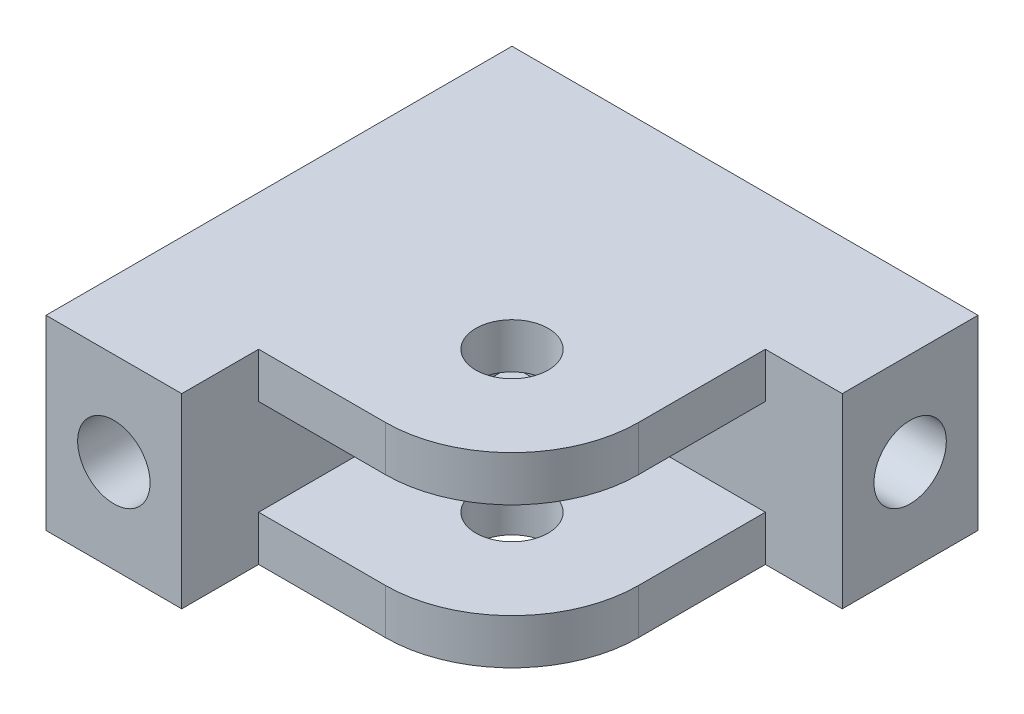
ISO-10303-21;
HEADER;
FILE_DESCRIPTION(('STEP AP214'),'2;1');
FILE_NAME('part.step','',(''),(''),'','','');
FILE_SCHEMA(('AUTOMOTIVE_DESIGN { 1 0 10303 214 1 1 1 1 }'));
ENDSEC;
DATA;
#1=APPLICATION_CONTEXT('core data for automotive mechanical design processes');
#2=APPLICATION_PROTOCOL_DEFINITION('international standard','automotive_design',2000,#1);
#3=PRODUCT_CONTEXT('',#1,'mechanical');
#4=PRODUCT('Part','Part','',(#3));
#5=PRODUCT_RELATED_PRODUCT_CATEGORY('part','',(#4));
#6=PRODUCT_DEFINITION_FORMATION('','',#4);
#7=PRODUCT_DEFINITION_CONTEXT('part definition',#1,'design');
#8=PRODUCT_DEFINITION('design','',#6,#7);
#9=PRODUCT_DEFINITION_SHAPE('','',#8);
#10=(LENGTH_UNIT() NAMED_UNIT(*) SI_UNIT(.MILLI.,.METRE.));
#11=(NAMED_UNIT(*) PLANE_ANGLE_UNIT() SI_UNIT($,.RADIAN.));
#12=(NAMED_UNIT(*) SI_UNIT($,.STERADIAN.) SOLID_ANGLE_UNIT());
#13=UNCERTAINTY_MEASURE_WITH_UNIT(LENGTH_MEASURE(1.E-05),#10,'distance_accuracy_value','');
#14=(GEOMETRIC_REPRESENTATION_CONTEXT(3) GLOBAL_UNCERTAINTY_ASSIGNED_CONTEXT((#13)) GLOBAL_UNIT_ASSIGNED_CONTEXT((#10,
#11,#12)) REPRESENTATION_CONTEXT('',''));
#15=CARTESIAN_POINT('',(0.,0.,0.));
#16=DIRECTION('',(0.,0.,1.));
#17=DIRECTION('',(1.,0.,0.));
#18=AXIS2_PLACEMENT_3D('',#15,#16,#17);
#19=CARTESIAN_POINT('',(-38.4937857618097,20.6,0.));
#20=DIRECTION('',(-1.,0.,0.));
#21=DIRECTION('',(0.,0.,1.));
#22=AXIS2_PLACEMENT_3D('',#19,#20,#21);
#23=PLANE('',#22);
#24=DIRECTION('',(0.,1.,0.));
#25=VECTOR('',#24,1.);
#26=CARTESIAN_POINT('',(-38.4937857618097,15.6,-15.6373422700728));
#27=LINE('',#26,#25);
#28=CARTESIAN_POINT('',(-38.4937857618097,15.6,-15.6373422700728));
#29=VERTEX_POINT('',#28);
#30=CARTESIAN_POINT('',(-38.4937857618097,20.6,-15.6373422700728));
#31=VERTEX_POINT('',#30);
#32=EDGE_CURVE('E153',#29,#31,#27,.T.);
#33=ORIENTED_EDGE('',*,*,#32,.T.);
#34=DIRECTION('',(0.,0.,-1.));
#35=VECTOR('',#34,1.);
#36=CARTESIAN_POINT('',(-38.4937857618097,20.6,0.));
#37=LINE('',#36,#35);
#38=CARTESIAN_POINT('',(-38.4937857618097,20.6,-7.13734227007282));
#39=VERTEX_POINT('',#38);
#40=EDGE_CURVE('E225',#39,#31,#37,.T.);
#41=ORIENTED_EDGE('',*,*,#40,.F.);
#42=DIRECTION('',(0.,-1.,0.));
#43=VECTOR('',#42,1.);
#44=CARTESIAN_POINT('',(-38.4937857618097,20.6,-7.13734227007282));
#45=LINE('',#44,#43);
#46=CARTESIAN_POINT('',(-38.4937857618097,0.,-7.13734227007282));
#47=VERTEX_POINT('',#46);
#48=EDGE_CURVE('E264',#39,#47,#45,.T.);
#49=ORIENTED_EDGE('',*,*,#48,.T.);
#50=DIRECTION('',(0.,0.,-1.));
#51=VECTOR('',#50,1.);
#52=CARTESIAN_POINT('',(-38.4937857618097,0.,0.));
#53=LINE('',#52,#51);
#54=CARTESIAN_POINT('',(-38.4937857618097,0.,-15.6373422700728));
#55=VERTEX_POINT('',#54);
#56=EDGE_CURVE('E242',#47,#55,#53,.T.);
#57=ORIENTED_EDGE('',*,*,#56,.T.);
#58=DIRECTION('',(0.,-1.,0.));
#59=VECTOR('',#58,1.);
#60=CARTESIAN_POINT('',(-38.4937857618097,5.,-15.6373422700728));
#61=LINE('',#60,#59);
#62=CARTESIAN_POINT('',(-38.4937857618097,5.,-15.6373422700728));
#63=VERTEX_POINT('',#62);
#64=EDGE_CURVE('E201',#63,#55,#61,.T.);
#65=ORIENTED_EDGE('',*,*,#64,.F.);
#66=DIRECTION('',(0.,0.,-1.));
#67=VECTOR('',#66,1.);
#68=CARTESIAN_POINT('',(-38.4937857618097,5.,0.));
#69=LINE('',#68,#67);
#70=CARTESIAN_POINT('',(-38.4937857618097,5.,-43.6373422700728));
#71=VERTEX_POINT('',#70);
#72=EDGE_CURVE('E198',#63,#71,#69,.T.);
#73=ORIENTED_EDGE('',*,*,#72,.T.);
#74=DIRECTION('',(0.,-1.,0.));
#75=VECTOR('',#74,1.);
#76=CARTESIAN_POINT('',(-38.4937857618097,20.6,-43.6373422700728));
#77=LINE('',#76,#75);
#78=CARTESIAN_POINT('',(-38.4937857618097,15.6,-43.6373422700728));
#79=VERTEX_POINT('',#78);
#80=EDGE_CURVE('E262',#79,#71,#77,.T.);
#81=ORIENTED_EDGE('',*,*,#80,.F.);
#82=DIRECTION('',(0.,0.,-1.));
#83=VECTOR('',#82,1.);
#84=CARTESIAN_POINT('',(-38.4937857618097,15.6,0.));
#85=LINE('',#84,#83);
#86=EDGE_CURVE('E59',#29,#79,#85,.T.);
#87=ORIENTED_EDGE('',*,*,#86,.F.);
#88=EDGE_LOOP('',(#33,#41,#49,#57,#65,#73,#81,#87));
#89=FACE_BOUND('',#88,.T.);
#90=ADVANCED_FACE('F36',(#89),#23,.F.);
#91=CARTESIAN_POINT('',(0.,20.6,-43.6373422700728));
#92=DIRECTION('',(0.,0.,1.));
#93=DIRECTION('',(1.,0.,0.));
#94=AXIS2_PLACEMENT_3D('',#91,#92,#93);
#95=PLANE('',#94);
#96=DIRECTION('',(0.,1.,0.));
#97=VECTOR('',#96,1.);
#98=CARTESIAN_POINT('',(-10.4937857618097,15.6,-43.6373422700728));
#99=LINE('',#98,#97);
#100=CARTESIAN_POINT('',(-10.4937857618097,15.6,-43.6373422700728));
#101=VERTEX_POINT('',#100);
#102=CARTESIAN_POINT('',(-10.4937857618097,20.6,-43.6373422700728));
#103=VERTEX_POINT('',#102);
#104=EDGE_CURVE('E51',#101,#103,#99,.T.);
#105=ORIENTED_EDGE('',*,*,#104,.F.);
#106=DIRECTION('',(-1.,0.,0.));
#107=VECTOR('',#106,1.);
#108=CARTESIAN_POINT('',(0.,15.6,-43.6373422700728));
#109=LINE('',#108,#107);
#110=EDGE_CURVE('E162',#101,#79,#109,.T.);
#111=ORIENTED_EDGE('',*,*,#110,.T.);
#112=ORIENTED_EDGE('',*,*,#80,.T.);
#113=DIRECTION('',(-1.,0.,0.));
#114=VECTOR('',#113,1.);
#115=CARTESIAN_POINT('',(0.,5.,-43.6373422700728));
#116=LINE('',#115,#114);
#117=CARTESIAN_POINT('',(-10.4937857618097,5.,-43.6373422700728));
#118=VERTEX_POINT('',#117);
#119=EDGE_CURVE('E195',#118,#71,#116,.T.);
#120=ORIENTED_EDGE('',*,*,#119,.F.);
#121=DIRECTION('',(0.,-1.,0.));
#122=VECTOR('',#121,1.);
#123=CARTESIAN_POINT('',(-10.4937857618097,5.,-43.6373422700728));
#124=LINE('',#123,#122);
#125=CARTESIAN_POINT('',(-10.4937857618097,0.,-43.6373422700728));
#126=VERTEX_POINT('',#125);
#127=EDGE_CURVE('E214',#118,#126,#124,.T.);
#128=ORIENTED_EDGE('',*,*,#127,.T.);
#129=DIRECTION('',(-1.,0.,0.));
#130=VECTOR('',#129,1.);
#131=CARTESIAN_POINT('',(0.,0.,-43.6373422700728));
#132=LINE('',#131,#130);
#133=CARTESIAN_POINT('',(-1.99378576180973,0.,-43.6373422700728));
#134=VERTEX_POINT('',#133);
#135=EDGE_CURVE('E244',#134,#126,#132,.T.);
#136=ORIENTED_EDGE('',*,*,#135,.F.);
#137=DIRECTION('',(0.,-1.,0.));
#138=VECTOR('',#137,1.);
#139=CARTESIAN_POINT('',(-1.99378576180973,20.6,-43.6373422700728));
#140=LINE('',#139,#138);
#141=CARTESIAN_POINT('',(-1.99378576180973,20.6,-43.6373422700728));
#142=VERTEX_POINT('',#141);
#143=EDGE_CURVE('E260',#142,#134,#140,.T.);
#144=ORIENTED_EDGE('',*,*,#143,.F.);
#145=DIRECTION('',(-1.,0.,0.));
#146=VECTOR('',#145,1.);
#147=CARTESIAN_POINT('',(0.,20.6,-43.6373422700728));
#148=LINE('',#147,#146);
#149=EDGE_CURVE('E229',#142,#103,#148,.T.);
#150=ORIENTED_EDGE('',*,*,#149,.T.);
#151=EDGE_LOOP('',(#105,#111,#112,#120,#128,#136,#144,#150));
#152=FACE_BOUND('',#151,.T.);
#153=ADVANCED_FACE('F286',(#152),#95,.T.);
#154=CARTESIAN_POINT('',(0.,20.6,-7.13734227007282));
#155=DIRECTION('',(0.,0.,-1.));
#156=DIRECTION('',(-1.,0.,0.));
#157=AXIS2_PLACEMENT_3D('',#154,#155,#156);
#158=PLANE('',#157);
#159=CARTESIAN_POINT('',(-45.9937857618097,10.3,-7.13734227007282));
#160=DIRECTION('',(0.,0.,1.));
#161=DIRECTION('',(1.,0.,0.));
#162=AXIS2_PLACEMENT_3D('',#159,#160,#161);
#163=CIRCLE('',#162,4.);
#164=CARTESIAN_POINT('',(-41.9937857618097,10.3,-7.13734227007282));
#165=VERTEX_POINT('',#164);
#166=EDGE_CURVE('E172',#165,#165,#163,.T.);
#167=ORIENTED_EDGE('',*,*,#166,.F.);
#168=EDGE_LOOP('',(#167));
#169=FACE_BOUND('',#168,.T.);
#170=DIRECTION('',(1.,0.,0.));
#171=VECTOR('',#170,1.);
#172=CARTESIAN_POINT('',(0.,0.,-7.13734227007282));
#173=LINE('',#172,#171);
#174=CARTESIAN_POINT('',(-53.4937857618097,0.,-7.13734227007282));
#175=VERTEX_POINT('',#174);
#176=EDGE_CURVE('E221',#175,#47,#173,.T.);
#177=ORIENTED_EDGE('',*,*,#176,.T.);
#178=ORIENTED_EDGE('',*,*,#48,.F.);
#179=DIRECTION('',(1.,0.,0.));
#180=VECTOR('',#179,1.);
#181=CARTESIAN_POINT('',(0.,20.6,-7.13734227007282));
#182=LINE('',#181,#180);
#183=CARTESIAN_POINT('',(-53.4937857618097,20.6,-7.13734227007282));
#184=VERTEX_POINT('',#183);
#185=EDGE_CURVE('E222',#184,#39,#182,.T.);
#186=ORIENTED_EDGE('',*,*,#185,.F.);
#187=DIRECTION('',(0.,-1.,0.));
#188=VECTOR('',#187,1.);
#189=CARTESIAN_POINT('',(-53.4937857618097,20.6,-7.13734227007282));
#190=LINE('',#189,#188);
#191=EDGE_CURVE('E239',#184,#175,#190,.T.);
#192=ORIENTED_EDGE('',*,*,#191,.T.);
#193=EDGE_LOOP('',(#177,#178,#186,#192));
#194=FACE_BOUND('',#193,.T.);
#195=ADVANCED_FACE('F291',(#169,#194),#158,.F.);
#196=CARTESIAN_POINT('',(-1.99378576180973,20.6,0.));
#197=DIRECTION('',(1.,0.,0.));
#198=DIRECTION('',(0.,0.,-1.));
#199=AXIS2_PLACEMENT_3D('',#196,#197,#198);
#200=PLANE('',#199);
#201=CARTESIAN_POINT('',(-1.99378576180973,10.3,-51.1373422700728));
#202=DIRECTION('',(1.,0.,0.));
#203=DIRECTION('',(0.,0.,-1.));
#204=AXIS2_PLACEMENT_3D('',#201,#202,#203);
#205=CIRCLE('',#204,4.00000000000001);
#206=CARTESIAN_POINT('',(-1.99378576180973,10.3,-55.1373422700728));
#207=VERTEX_POINT('',#206);
#208=EDGE_CURVE('E320',#207,#207,#205,.T.);
#209=ORIENTED_EDGE('',*,*,#208,.F.);
#210=EDGE_LOOP('',(#209));
#211=FACE_BOUND('',#210,.T.);
#212=DIRECTION('',(0.,0.,1.));
#213=VECTOR('',#212,1.);
#214=CARTESIAN_POINT('',(-1.99378576180973,0.,0.));
#215=LINE('',#214,#213);
#216=CARTESIAN_POINT('',(-1.99378576180973,0.,-58.6373422700728));
#217=VERTEX_POINT('',#216);
#218=EDGE_CURVE('E247',#217,#134,#215,.T.);
#219=ORIENTED_EDGE('',*,*,#218,.F.);
#220=DIRECTION('',(0.,-1.,0.));
#221=VECTOR('',#220,1.);
#222=CARTESIAN_POINT('',(-1.99378576180973,20.6,-58.6373422700728));
#223=LINE('',#222,#221);
#224=CARTESIAN_POINT('',(-1.99378576180973,20.6,-58.6373422700728));
#225=VERTEX_POINT('',#224);
#226=EDGE_CURVE('E258',#225,#217,#223,.T.);
#227=ORIENTED_EDGE('',*,*,#226,.F.);
#228=DIRECTION('',(0.,0.,1.));
#229=VECTOR('',#228,1.);
#230=CARTESIAN_POINT('',(-1.99378576180973,20.6,0.));
#231=LINE('',#230,#229);
#232=EDGE_CURVE('E231',#225,#142,#231,.T.);
#233=ORIENTED_EDGE('',*,*,#232,.T.);
#234=ORIENTED_EDGE('',*,*,#143,.T.);
#235=EDGE_LOOP('',(#219,#227,#233,#234));
#236=FACE_BOUND('',#235,.T.);
#237=ADVANCED_FACE('F296',(#211,#236),#200,.T.);
#238=CARTESIAN_POINT('',(0.,20.6,-58.6373422700728));
#239=DIRECTION('',(0.,0.,-1.));
#240=DIRECTION('',(-1.,0.,0.));
#241=AXIS2_PLACEMENT_3D('',#238,#239,#240);
#242=PLANE('',#241);
#243=DIRECTION('',(1.,0.,0.));
#244=VECTOR('',#243,1.);
#245=CARTESIAN_POINT('',(0.,0.,-58.6373422700728));
#246=LINE('',#245,#244);
#247=CARTESIAN_POINT('',(-53.4937857618097,0.,-58.6373422700728));
#248=VERTEX_POINT('',#247);
#249=EDGE_CURVE('E250',#248,#217,#246,.T.);
#250=ORIENTED_EDGE('',*,*,#249,.F.);
#251=DIRECTION('',(0.,-1.,0.));
#252=VECTOR('',#251,1.);
#253=CARTESIAN_POINT('',(-53.4937857618097,20.6,-58.6373422700728));
#254=LINE('',#253,#252);
#255=CARTESIAN_POINT('',(-53.4937857618097,20.6,-58.6373422700728));
#256=VERTEX_POINT('',#255);
#257=EDGE_CURVE('E256',#256,#248,#254,.T.);
#258=ORIENTED_EDGE('',*,*,#257,.F.);
#259=DIRECTION('',(1.,0.,0.));
#260=VECTOR('',#259,1.);
#261=CARTESIAN_POINT('',(0.,20.6,-58.6373422700728));
#262=LINE('',#261,#260);
#263=EDGE_CURVE('E234',#256,#225,#262,.T.);
#264=ORIENTED_EDGE('',*,*,#263,.T.);
#265=ORIENTED_EDGE('',*,*,#226,.T.);
#266=EDGE_LOOP('',(#250,#258,#264,#265));
#267=FACE_BOUND('',#266,.T.);
#268=ADVANCED_FACE('F348',(#267),#242,.T.);
#269=CARTESIAN_POINT('',(-53.4937857618097,20.6,0.));
#270=DIRECTION('',(1.,0.,0.));
#271=DIRECTION('',(0.,0.,-1.));
#272=AXIS2_PLACEMENT_3D('',#269,#270,#271);
#273=PLANE('',#272);
#274=DIRECTION('',(0.,0.,1.));
#275=VECTOR('',#274,1.);
#276=CARTESIAN_POINT('',(-53.4937857618097,0.,0.));
#277=LINE('',#276,#275);
#278=EDGE_CURVE('E226',#248,#175,#277,.T.);
#279=ORIENTED_EDGE('',*,*,#278,.T.);
#280=ORIENTED_EDGE('',*,*,#191,.F.);
#281=DIRECTION('',(0.,0.,1.));
#282=VECTOR('',#281,1.);
#283=CARTESIAN_POINT('',(-53.4937857618097,20.6,0.));
#284=LINE('',#283,#282);
#285=EDGE_CURVE('E237',#256,#184,#284,.T.);
#286=ORIENTED_EDGE('',*,*,#285,.F.);
#287=ORIENTED_EDGE('',*,*,#257,.T.);
#288=EDGE_LOOP('',(#279,#280,#286,#287));
#289=FACE_BOUND('',#288,.T.);
#290=ADVANCED_FACE('F338',(#289),#273,.F.);
#291=CARTESIAN_POINT('',(0.,20.6,0.));
#292=DIRECTION('',(0.,1.,0.));
#293=DIRECTION('',(0.,0.,1.));
#294=AXIS2_PLACEMENT_3D('',#291,#292,#293);
#295=PLANE('',#294);
#296=ORIENTED_EDGE('',*,*,#185,.T.);
#297=ORIENTED_EDGE('',*,*,#40,.T.);
#298=DIRECTION('',(-1.,0.,0.));
#299=VECTOR('',#298,1.);
#300=CARTESIAN_POINT('',(0.,20.6,-15.6373422700728));
#301=LINE('',#300,#299);
#302=CARTESIAN_POINT('',(-24.4937857618097,20.6,-15.6373422700728));
#303=VERTEX_POINT('',#302);
#304=EDGE_CURVE('E171',#303,#31,#301,.T.);
#305=ORIENTED_EDGE('',*,*,#304,.F.);
#306=CARTESIAN_POINT('',(-24.4937857618097,20.6,-29.6373422700728));
#307=DIRECTION('',(0.,1.,0.));
#308=DIRECTION('',(0.,0.,1.));
#309=AXIS2_PLACEMENT_3D('',#306,#307,#308);
#310=CIRCLE('',#309,14.);
#311=CARTESIAN_POINT('',(-10.4937857618097,20.6,-29.6373422700728));
#312=VERTEX_POINT('',#311);
#313=EDGE_CURVE('E144',#303,#312,#310,.T.);
#314=ORIENTED_EDGE('',*,*,#313,.T.);
#315=DIRECTION('',(0.,0.,-1.));
#316=VECTOR('',#315,1.);
#317=CARTESIAN_POINT('',(-10.4937857618097,20.6,0.));
#318=LINE('',#317,#316);
#319=EDGE_CURVE('E175',#312,#103,#318,.T.);
#320=ORIENTED_EDGE('',*,*,#319,.T.);
#321=ORIENTED_EDGE('',*,*,#149,.F.);
#322=ORIENTED_EDGE('',*,*,#232,.F.);
#323=ORIENTED_EDGE('',*,*,#263,.F.);
#324=ORIENTED_EDGE('',*,*,#285,.T.);
#325=EDGE_LOOP('',(#296,#297,#305,#314,#320,#321,#322,#323,#324));
#326=FACE_BOUND('',#325,.T.);
#327=CARTESIAN_POINT('',(-24.4937857618097,20.6,-29.6373422700728));
#328=DIRECTION('',(0.,1.,0.));
#329=DIRECTION('',(0.,0.,1.));
#330=AXIS2_PLACEMENT_3D('',#327,#328,#329);
#331=CIRCLE('',#330,4.);
#332=CARTESIAN_POINT('',(-24.4937857618097,20.6,-25.6373422700728));
#333=VERTEX_POINT('',#332);
#334=EDGE_CURVE('E168',#333,#333,#331,.T.);
#335=ORIENTED_EDGE('',*,*,#334,.F.);
#336=EDGE_LOOP('',(#335));
#337=FACE_BOUND('',#336,.T.);
#338=ADVANCED_FACE('F335',(#326,#337),#295,.T.);
#339=CARTESIAN_POINT('',(0.,0.,0.));
#340=DIRECTION('',(0.,1.,0.));
#341=DIRECTION('',(0.,0.,1.));
#342=AXIS2_PLACEMENT_3D('',#339,#340,#341);
#343=PLANE('',#342);
#344=ORIENTED_EDGE('',*,*,#176,.F.);
#345=ORIENTED_EDGE('',*,*,#278,.F.);
#346=ORIENTED_EDGE('',*,*,#249,.T.);
#347=ORIENTED_EDGE('',*,*,#218,.T.);
#348=ORIENTED_EDGE('',*,*,#135,.T.);
#349=DIRECTION('',(0.,0.,-1.));
#350=VECTOR('',#349,1.);
#351=CARTESIAN_POINT('',(-10.4937857618097,0.,0.));
#352=LINE('',#351,#350);
#353=CARTESIAN_POINT('',(-10.4937857618097,0.,-29.6373422700728));
#354=VERTEX_POINT('',#353);
#355=EDGE_CURVE('E186',#354,#126,#352,.T.);
#356=ORIENTED_EDGE('',*,*,#355,.F.);
#357=CARTESIAN_POINT('',(-24.4937857618097,0.,-29.6373422700728));
#358=DIRECTION('',(0.,1.,0.));
#359=DIRECTION('',(0.,0.,1.));
#360=AXIS2_PLACEMENT_3D('',#357,#358,#359);
#361=CIRCLE('',#360,14.);
#362=CARTESIAN_POINT('',(-24.4937857618097,0.,-15.6373422700728));
#363=VERTEX_POINT('',#362);
#364=EDGE_CURVE('E207',#363,#354,#361,.T.);
#365=ORIENTED_EDGE('',*,*,#364,.F.);
#366=DIRECTION('',(-1.,0.,0.));
#367=VECTOR('',#366,1.);
#368=CARTESIAN_POINT('',(0.,0.,-15.6373422700728));
#369=LINE('',#368,#367);
#370=EDGE_CURVE('E204',#363,#55,#369,.T.);
#371=ORIENTED_EDGE('',*,*,#370,.T.);
#372=ORIENTED_EDGE('',*,*,#56,.F.);
#373=EDGE_LOOP('',(#344,#345,#346,#347,#348,#356,#365,#371,#372));
#374=FACE_BOUND('',#373,.T.);
#375=CARTESIAN_POINT('',(-24.4937857618097,0.,-29.6373422700728));
#376=DIRECTION('',(0.,1.,0.));
#377=DIRECTION('',(0.,0.,1.));
#378=AXIS2_PLACEMENT_3D('',#375,#376,#377);
#379=CIRCLE('',#378,4.);
#380=CARTESIAN_POINT('',(-24.4937857618097,0.,-25.6373422700728));
#381=VERTEX_POINT('',#380);
#382=EDGE_CURVE('E179',#381,#381,#379,.T.);
#383=ORIENTED_EDGE('',*,*,#382,.T.);
#384=EDGE_LOOP('',(#383));
#385=FACE_BOUND('',#384,.T.);
#386=ADVANCED_FACE('F337',(#374,#385),#343,.F.);
#387=CARTESIAN_POINT('',(0.,5.,-15.6373422700728));
#388=DIRECTION('',(0.,0.,1.));
#389=DIRECTION('',(1.,0.,0.));
#390=AXIS2_PLACEMENT_3D('',#387,#388,#389);
#391=PLANE('',#390);
#392=ORIENTED_EDGE('',*,*,#370,.F.);
#393=DIRECTION('',(0.,-1.,0.));
#394=VECTOR('',#393,1.);
#395=CARTESIAN_POINT('',(-24.4937857618097,5.,-15.6373422700728));
#396=LINE('',#395,#394);
#397=CARTESIAN_POINT('',(-24.4937857618097,5.,-15.6373422700728));
#398=VERTEX_POINT('',#397);
#399=EDGE_CURVE('E219',#398,#363,#396,.T.);
#400=ORIENTED_EDGE('',*,*,#399,.F.);
#401=DIRECTION('',(-1.,0.,0.));
#402=VECTOR('',#401,1.);
#403=CARTESIAN_POINT('',(0.,5.,-15.6373422700728));
#404=LINE('',#403,#402);
#405=EDGE_CURVE('E185',#398,#63,#404,.T.);
#406=ORIENTED_EDGE('',*,*,#405,.T.);
#407=ORIENTED_EDGE('',*,*,#64,.T.);
#408=EDGE_LOOP('',(#392,#400,#406,#407));
#409=FACE_BOUND('',#408,.T.);
#410=ADVANCED_FACE('F345',(#409),#391,.T.);
#411=CARTESIAN_POINT('',(-24.4937857618097,5.,-29.6373422700728));
#412=DIRECTION('',(0.,-1.,0.));
#413=DIRECTION('',(0.,0.,-1.));
#414=AXIS2_PLACEMENT_3D('',#411,#412,#413);
#415=CYLINDRICAL_SURFACE('',#414,14.);
#416=ORIENTED_EDGE('',*,*,#364,.T.);
#417=DIRECTION('',(0.,-1.,0.));
#418=VECTOR('',#417,1.);
#419=CARTESIAN_POINT('',(-10.4937857618097,5.,-29.6373422700728));
#420=LINE('',#419,#418);
#421=CARTESIAN_POINT('',(-10.4937857618097,5.,-29.6373422700728));
#422=VERTEX_POINT('',#421);
#423=EDGE_CURVE('E216',#422,#354,#420,.T.);
#424=ORIENTED_EDGE('',*,*,#423,.F.);
#425=CARTESIAN_POINT('',(-24.4937857618097,5.,-29.6373422700728));
#426=DIRECTION('',(0.,1.,0.));
#427=DIRECTION('',(0.,0.,1.));
#428=AXIS2_PLACEMENT_3D('',#425,#426,#427);
#429=CIRCLE('',#428,14.);
#430=EDGE_CURVE('E189',#398,#422,#429,.T.);
#431=ORIENTED_EDGE('',*,*,#430,.F.);
#432=ORIENTED_EDGE('',*,*,#399,.T.);
#433=EDGE_LOOP('',(#416,#424,#431,#432));
#434=FACE_BOUND('',#433,.T.);
#435=ADVANCED_FACE('F392',(#434),#415,.T.);
#436=CARTESIAN_POINT('',(-10.4937857618097,5.,0.));
#437=DIRECTION('',(-1.,0.,0.));
#438=DIRECTION('',(0.,0.,1.));
#439=AXIS2_PLACEMENT_3D('',#436,#437,#438);
#440=PLANE('',#439);
#441=ORIENTED_EDGE('',*,*,#355,.T.);
#442=ORIENTED_EDGE('',*,*,#127,.F.);
#443=DIRECTION('',(0.,0.,-1.));
#444=VECTOR('',#443,1.);
#445=CARTESIAN_POINT('',(-10.4937857618097,5.,0.));
#446=LINE('',#445,#444);
#447=EDGE_CURVE('E192',#422,#118,#446,.T.);
#448=ORIENTED_EDGE('',*,*,#447,.F.);
#449=ORIENTED_EDGE('',*,*,#423,.T.);
#450=EDGE_LOOP('',(#441,#442,#448,#449));
#451=FACE_BOUND('',#450,.T.);
#452=ADVANCED_FACE('F389',(#451),#440,.F.);
#453=CARTESIAN_POINT('',(-24.4937857618097,5.,-29.6373422700728));
#454=DIRECTION('',(0.,-1.,0.));
#455=DIRECTION('',(0.,0.,-1.));
#456=AXIS2_PLACEMENT_3D('',#453,#454,#455);
#457=CYLINDRICAL_SURFACE('',#456,4.);
#458=CARTESIAN_POINT('',(-24.4937857618097,5.,-29.6373422700728));
#459=DIRECTION('',(0.,1.,0.));
#460=DIRECTION('',(0.,0.,1.));
#461=AXIS2_PLACEMENT_3D('',#458,#459,#460);
#462=CIRCLE('',#461,4.);
#463=CARTESIAN_POINT('',(-24.4937857618097,5.,-25.6373422700728));
#464=VERTEX_POINT('',#463);
#465=EDGE_CURVE('E182',#464,#464,#462,.T.);
#466=ORIENTED_EDGE('',*,*,#465,.T.);
#467=EDGE_LOOP('',(#466));
#468=FACE_BOUND('',#467,.T.);
#469=ORIENTED_EDGE('',*,*,#382,.F.);
#470=EDGE_LOOP('',(#469));
#471=FACE_BOUND('',#470,.T.);
#472=ADVANCED_FACE('F352',(#468,#471),#457,.F.);
#473=CARTESIAN_POINT('',(0.,5.,0.));
#474=DIRECTION('',(0.,1.,0.));
#475=DIRECTION('',(0.,0.,1.));
#476=AXIS2_PLACEMENT_3D('',#473,#474,#475);
#477=PLANE('',#476);
#478=ORIENTED_EDGE('',*,*,#465,.F.);
#479=EDGE_LOOP('',(#478));
#480=FACE_BOUND('',#479,.T.);
#481=ORIENTED_EDGE('',*,*,#405,.F.);
#482=ORIENTED_EDGE('',*,*,#430,.T.);
#483=ORIENTED_EDGE('',*,*,#447,.T.);
#484=ORIENTED_EDGE('',*,*,#119,.T.);
#485=ORIENTED_EDGE('',*,*,#72,.F.);
#486=EDGE_LOOP('',(#481,#482,#483,#484,#485));
#487=FACE_BOUND('',#486,.T.);
#488=ADVANCED_FACE('F386',(#480,#487),#477,.T.);
#489=CARTESIAN_POINT('',(0.,15.6,-15.6373422700728));
#490=DIRECTION('',(0.,0.,-1.));
#491=DIRECTION('',(-1.,0.,0.));
#492=AXIS2_PLACEMENT_3D('',#489,#490,#491);
#493=PLANE('',#492);
#494=ORIENTED_EDGE('',*,*,#304,.T.);
#495=ORIENTED_EDGE('',*,*,#32,.F.);
#496=DIRECTION('',(-1.,0.,0.));
#497=VECTOR('',#496,1.);
#498=CARTESIAN_POINT('',(0.,15.6,-15.6373422700728));
#499=LINE('',#498,#497);
#500=CARTESIAN_POINT('',(-24.4937857618097,15.6,-15.6373422700728));
#501=VERTEX_POINT('',#500);
#502=EDGE_CURVE('E151',#501,#29,#499,.T.);
#503=ORIENTED_EDGE('',*,*,#502,.F.);
#504=DIRECTION('',(0.,1.,0.));
#505=VECTOR('',#504,1.);
#506=CARTESIAN_POINT('',(-24.4937857618097,15.6,-15.6373422700728));
#507=LINE('',#506,#505);
#508=EDGE_CURVE('E138',#501,#303,#507,.T.);
#509=ORIENTED_EDGE('',*,*,#508,.T.);
#510=EDGE_LOOP('',(#494,#495,#503,#509));
#511=FACE_BOUND('',#510,.T.);
#512=ADVANCED_FACE('F152',(#511),#493,.F.);
#513=CARTESIAN_POINT('',(-10.4937857618097,15.6,0.));
#514=DIRECTION('',(1.,0.,0.));
#515=DIRECTION('',(0.,0.,-1.));
#516=AXIS2_PLACEMENT_3D('',#513,#514,#515);
#517=PLANE('',#516);
#518=ORIENTED_EDGE('',*,*,#319,.F.);
#519=DIRECTION('',(0.,1.,0.));
#520=VECTOR('',#519,1.);
#521=CARTESIAN_POINT('',(-10.4937857618097,15.6,-29.6373422700728));
#522=LINE('',#521,#520);
#523=CARTESIAN_POINT('',(-10.4937857618097,15.6,-29.6373422700728));
#524=VERTEX_POINT('',#523);
#525=EDGE_CURVE('E148',#524,#312,#522,.T.);
#526=ORIENTED_EDGE('',*,*,#525,.F.);
#527=DIRECTION('',(0.,0.,-1.));
#528=VECTOR('',#527,1.);
#529=CARTESIAN_POINT('',(-10.4937857618097,15.6,0.));
#530=LINE('',#529,#528);
#531=EDGE_CURVE('E160',#524,#101,#530,.T.);
#532=ORIENTED_EDGE('',*,*,#531,.T.);
#533=ORIENTED_EDGE('',*,*,#104,.T.);
#534=EDGE_LOOP('',(#518,#526,#532,#533));
#535=FACE_BOUND('',#534,.T.);
#536=ADVANCED_FACE('F331',(#535),#517,.T.);
#537=CARTESIAN_POINT('',(-24.4937857618097,15.6,-29.6373422700728));
#538=DIRECTION('',(0.,1.,0.));
#539=DIRECTION('',(0.,0.,1.));
#540=AXIS2_PLACEMENT_3D('',#537,#538,#539);
#541=CYLINDRICAL_SURFACE('',#540,4.);
#542=CARTESIAN_POINT('',(-24.4937857618097,15.6,-29.6373422700728));
#543=DIRECTION('',(0.,1.,0.));
#544=DIRECTION('',(0.,0.,1.));
#545=AXIS2_PLACEMENT_3D('',#542,#543,#544);
#546=CIRCLE('',#545,4.);
#547=CARTESIAN_POINT('',(-24.4937857618097,15.6,-25.6373422700728));
#548=VERTEX_POINT('',#547);
#549=EDGE_CURVE('E155',#548,#548,#546,.T.);
#550=ORIENTED_EDGE('',*,*,#549,.F.);
#551=EDGE_LOOP('',(#550));
#552=FACE_BOUND('',#551,.T.);
#553=ORIENTED_EDGE('',*,*,#334,.T.);
#554=EDGE_LOOP('',(#553));
#555=FACE_BOUND('',#554,.T.);
#556=ADVANCED_FACE('F328',(#552,#555),#541,.F.);
#557=CARTESIAN_POINT('',(-24.4937857618097,15.6,-29.6373422700728));
#558=DIRECTION('',(0.,1.,0.));
#559=DIRECTION('',(0.,0.,1.));
#560=AXIS2_PLACEMENT_3D('',#557,#558,#559);
#561=CYLINDRICAL_SURFACE('',#560,14.);
#562=ORIENTED_EDGE('',*,*,#313,.F.);
#563=ORIENTED_EDGE('',*,*,#508,.F.);
#564=CARTESIAN_POINT('',(-24.4937857618097,15.6,-29.6373422700728));
#565=DIRECTION('',(0.,1.,0.));
#566=DIRECTION('',(0.,0.,1.));
#567=AXIS2_PLACEMENT_3D('',#564,#565,#566);
#568=CIRCLE('',#567,14.);
#569=EDGE_CURVE('E142',#501,#524,#568,.T.);
#570=ORIENTED_EDGE('',*,*,#569,.T.);
#571=ORIENTED_EDGE('',*,*,#525,.T.);
#572=EDGE_LOOP('',(#562,#563,#570,#571));
#573=FACE_BOUND('',#572,.T.);
#574=ADVANCED_FACE('F140',(#573),#561,.T.);
#575=CARTESIAN_POINT('',(0.,15.6,0.));
#576=DIRECTION('',(0.,1.,0.));
#577=DIRECTION('',(0.,0.,1.));
#578=AXIS2_PLACEMENT_3D('',#575,#576,#577);
#579=PLANE('',#578);
#580=ORIENTED_EDGE('',*,*,#549,.T.);
#581=EDGE_LOOP('',(#580));
#582=FACE_BOUND('',#581,.T.);
#583=ORIENTED_EDGE('',*,*,#502,.T.);
#584=ORIENTED_EDGE('',*,*,#86,.T.);
#585=ORIENTED_EDGE('',*,*,#110,.F.);
#586=ORIENTED_EDGE('',*,*,#531,.F.);
#587=ORIENTED_EDGE('',*,*,#569,.F.);
#588=EDGE_LOOP('',(#583,#584,#585,#586,#587));
#589=FACE_BOUND('',#588,.T.);
#590=ADVANCED_FACE('F158',(#582,#589),#579,.F.);
#591=CARTESIAN_POINT('',(-45.9937857618097,10.3,-47.1373422700728));
#592=DIRECTION('',(0.,0.,1.));
#593=DIRECTION('',(1.,0.,0.));
#594=AXIS2_PLACEMENT_3D('',#591,#592,#593);
#595=CYLINDRICAL_SURFACE('',#594,4.);
#596=CARTESIAN_POINT('',(-45.9937857618097,10.3,-46.1373422700728));
#597=DIRECTION('',(0.,0.,1.));
#598=DIRECTION('',(1.,0.,0.));
#599=AXIS2_PLACEMENT_3D('',#596,#597,#598);
#600=CIRCLE('',#599,4.);
#601=CARTESIAN_POINT('',(-41.9937857618097,10.3,-46.1373422700728));
#602=VERTEX_POINT('',#601);
#603=EDGE_CURVE('E270',#602,#602,#600,.F.);
#604=ORIENTED_EDGE('',*,*,#603,.T.);
#605=EDGE_LOOP('',(#604));
#606=FACE_BOUND('',#605,.T.);
#607=ORIENTED_EDGE('',*,*,#166,.T.);
#608=EDGE_LOOP('',(#607));
#609=FACE_BOUND('',#608,.T.);
#610=ADVANCED_FACE('F308',(#606,#609),#595,.F.);
#611=CARTESIAN_POINT('',(-45.9937857618097,10.3,-47.1373422700728));
#612=DIRECTION('',(0.,0.,1.));
#613=DIRECTION('',(1.,0.,0.));
#614=AXIS2_PLACEMENT_3D('',#611,#612,#613);
#615=PLANE('',#614);
#616=CARTESIAN_POINT('',(-45.9937857618097,10.3,-47.1373422700728));
#617=DIRECTION('',(0.,0.,1.));
#618=DIRECTION('',(1.,0.,0.));
#619=AXIS2_PLACEMENT_3D('',#616,#617,#618);
#620=CIRCLE('',#619,2.99999999999999);
#621=CARTESIAN_POINT('',(-42.9937857618097,10.3,-47.1373422700728));
#622=VERTEX_POINT('',#621);
#623=EDGE_CURVE('E267',#622,#622,#620,.T.);
#624=ORIENTED_EDGE('',*,*,#623,.T.);
#625=EDGE_LOOP('',(#624));
#626=FACE_BOUND('',#625,.T.);
#627=ADVANCED_FACE('F300',(#626),#615,.T.);
#628=CARTESIAN_POINT('',(-45.9937857618097,10.3,-47.1373422700728));
#629=DIRECTION('',(0.,0.,1.));
#630=DIRECTION('',(1.,0.,0.));
#631=AXIS2_PLACEMENT_3D('',#628,#629,#630);
#632=CONICAL_SURFACE('',#631,2.99999999999999,0.785398163397457);
#633=ORIENTED_EDGE('',*,*,#603,.F.);
#634=EDGE_LOOP('',(#633));
#635=FACE_BOUND('',#634,.T.);
#636=ORIENTED_EDGE('',*,*,#623,.F.);
#637=EDGE_LOOP('',(#636));
#638=FACE_BOUND('',#637,.T.);
#639=ADVANCED_FACE('F298',(#635,#638),#632,.F.);
#640=CARTESIAN_POINT('',(-41.9937857618097,10.3,-51.1373422700728));
#641=DIRECTION('',(1.,0.,0.));
#642=DIRECTION('',(0.,0.,-1.));
#643=AXIS2_PLACEMENT_3D('',#640,#641,#642);
#644=CYLINDRICAL_SURFACE('',#643,4.00000000000001);
#645=CARTESIAN_POINT('',(-40.9937857618097,10.3,-51.1373422700728));
#646=DIRECTION('',(1.,0.,0.));
#647=DIRECTION('',(0.,0.,-1.));
#648=AXIS2_PLACEMENT_3D('',#645,#646,#647);
#649=CIRCLE('',#648,4.00000000000001);
#650=CARTESIAN_POINT('',(-40.9937857618097,10.3,-55.1373422700728));
#651=VERTEX_POINT('',#650);
#652=EDGE_CURVE('E11',#651,#651,#649,.F.);
#653=ORIENTED_EDGE('',*,*,#652,.T.);
#654=EDGE_LOOP('',(#653));
#655=FACE_BOUND('',#654,.T.);
#656=ORIENTED_EDGE('',*,*,#208,.T.);
#657=EDGE_LOOP('',(#656));
#658=FACE_BOUND('',#657,.T.);
#659=ADVANCED_FACE('F282',(#655,#658),#644,.F.);
#660=CARTESIAN_POINT('',(-41.9937857618097,10.3,-51.1373422700728));
#661=DIRECTION('',(1.,0.,0.));
#662=DIRECTION('',(0.,0.,-1.));
#663=AXIS2_PLACEMENT_3D('',#660,#661,#662);
#664=PLANE('',#663);
#665=CARTESIAN_POINT('',(-41.9937857618097,10.3,-51.1373422700728));
#666=DIRECTION('',(1.,0.,0.));
#667=DIRECTION('',(0.,0.,-1.));
#668=AXIS2_PLACEMENT_3D('',#665,#666,#667);
#669=CIRCLE('',#668,3.);
#670=CARTESIAN_POINT('',(-41.9937857618097,10.3,-54.1373422700728));
#671=VERTEX_POINT('',#670);
#672=EDGE_CURVE('E44',#671,#671,#669,.T.);
#673=ORIENTED_EDGE('',*,*,#672,.T.);
#674=EDGE_LOOP('',(#673));
#675=FACE_BOUND('',#674,.T.);
#676=ADVANCED_FACE('F275',(#675),#664,.T.);
#677=CARTESIAN_POINT('',(-41.9937857618097,10.3,-51.1373422700728));
#678=DIRECTION('',(1.,0.,0.));
#679=DIRECTION('',(0.,0.,-1.));
#680=AXIS2_PLACEMENT_3D('',#677,#678,#679);
#681=CONICAL_SURFACE('',#680,3.,0.78539816339745);
#682=ORIENTED_EDGE('',*,*,#652,.F.);
#683=EDGE_LOOP('',(#682));
#684=FACE_BOUND('',#683,.T.);
#685=ORIENTED_EDGE('',*,*,#672,.F.);
#686=EDGE_LOOP('',(#685));
#687=FACE_BOUND('',#686,.T.);
#688=ADVANCED_FACE('F38',(#684,#687),#681,.F.);
#689=CLOSED_SHELL('',(#90,#153,#195,#237,#268,#290,#338,#386,#410,#435,#452,#472,#488,#512,#536,
#556,#574,#590,#610,#627,#639,#659,#676,#688));
#690=MANIFOLD_SOLID_BREP('B2',#689);
#691=ADVANCED_BREP_SHAPE_REPRESENTATION('',(#18,#690),#14);
#692=SHAPE_DEFINITION_REPRESENTATION(#9,#691);
ENDSEC;
END-ISO-10303-21;
